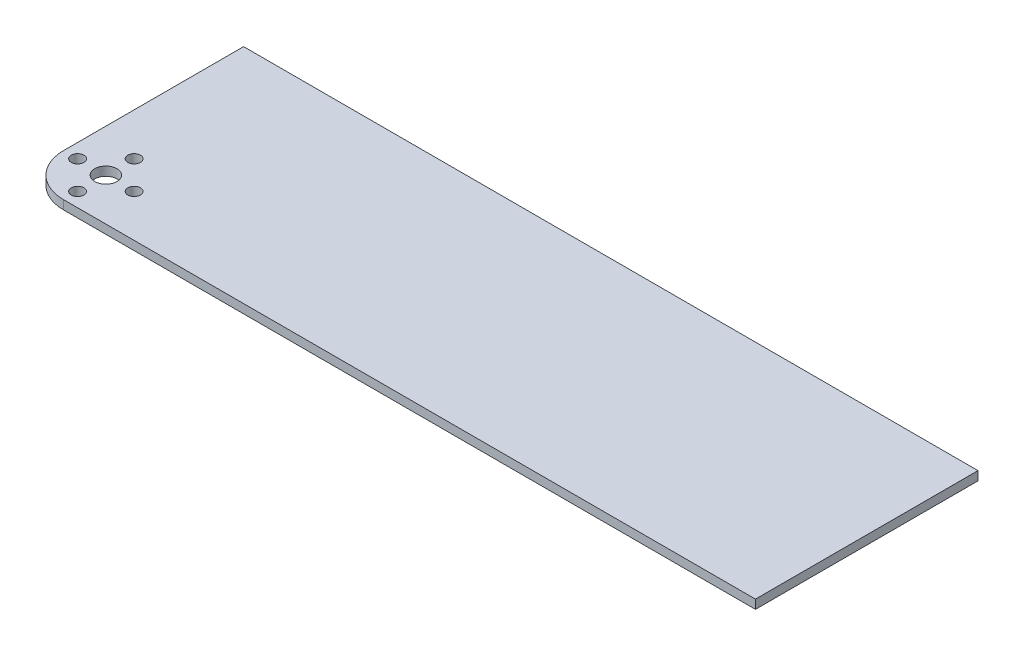
ISO-10303-21;
HEADER;
FILE_DESCRIPTION(('STEP AP214'),'2;1');
FILE_NAME('part.step','',(''),(''),'','','');
FILE_SCHEMA(('AUTOMOTIVE_DESIGN { 1 0 10303 214 1 1 1 1 }'));
ENDSEC;
DATA;
#1=APPLICATION_CONTEXT('core data for automotive mechanical design processes');
#2=APPLICATION_PROTOCOL_DEFINITION('international standard','automotive_design',2000,#1);
#3=PRODUCT_CONTEXT('',#1,'mechanical');
#4=PRODUCT('Part','Part','',(#3));
#5=PRODUCT_RELATED_PRODUCT_CATEGORY('part','',(#4));
#6=PRODUCT_DEFINITION_FORMATION('','',#4);
#7=PRODUCT_DEFINITION_CONTEXT('part definition',#1,'design');
#8=PRODUCT_DEFINITION('design','',#6,#7);
#9=PRODUCT_DEFINITION_SHAPE('','',#8);
#10=(LENGTH_UNIT() NAMED_UNIT(*) SI_UNIT(.MILLI.,.METRE.));
#11=(NAMED_UNIT(*) PLANE_ANGLE_UNIT() SI_UNIT($,.RADIAN.));
#12=(NAMED_UNIT(*) SI_UNIT($,.STERADIAN.) SOLID_ANGLE_UNIT());
#13=UNCERTAINTY_MEASURE_WITH_UNIT(LENGTH_MEASURE(1.E-05),#10,'distance_accuracy_value','');
#14=(GEOMETRIC_REPRESENTATION_CONTEXT(3) GLOBAL_UNCERTAINTY_ASSIGNED_CONTEXT((#13)) GLOBAL_UNIT_ASSIGNED_CONTEXT((#10,
#11,#12)) REPRESENTATION_CONTEXT('',''));
#15=CARTESIAN_POINT('',(0.,0.,0.));
#16=DIRECTION('',(0.,0.,1.));
#17=DIRECTION('',(1.,0.,0.));
#18=AXIS2_PLACEMENT_3D('',#15,#16,#17);
#19=CARTESIAN_POINT('',(-82.5,2.,0.));
#20=DIRECTION('',(-1.,0.,0.));
#21=DIRECTION('',(0.,0.,1.));
#22=AXIS2_PLACEMENT_3D('',#19,#20,#21);
#23=PLANE('',#22);
#24=DIRECTION('',(0.,0.,-1.));
#25=VECTOR('',#24,1.);
#26=CARTESIAN_POINT('',(-82.5,0.,0.));
#27=LINE('',#26,#25);
#28=CARTESIAN_POINT('',(-82.5,0.,15.475));
#29=VERTEX_POINT('',#28);
#30=CARTESIAN_POINT('',(-82.5,0.,-25.));
#31=VERTEX_POINT('',#30);
#32=EDGE_CURVE('E111',#29,#31,#27,.T.);
#33=ORIENTED_EDGE('',*,*,#32,.F.);
#34=DIRECTION('',(0.,-1.,0.));
#35=VECTOR('',#34,1.);
#36=CARTESIAN_POINT('',(-82.5,2.,15.475));
#37=LINE('',#36,#35);
#38=CARTESIAN_POINT('',(-82.5,2.,15.475));
#39=VERTEX_POINT('',#38);
#40=EDGE_CURVE('E11',#39,#29,#37,.T.);
#41=ORIENTED_EDGE('',*,*,#40,.F.);
#42=DIRECTION('',(0.,0.,-1.));
#43=VECTOR('',#42,1.);
#44=CARTESIAN_POINT('',(-82.5,2.,0.));
#45=LINE('',#44,#43);
#46=CARTESIAN_POINT('',(-82.5,2.,-25.));
#47=VERTEX_POINT('',#46);
#48=EDGE_CURVE('E122',#39,#47,#45,.T.);
#49=ORIENTED_EDGE('',*,*,#48,.T.);
#50=DIRECTION('',(0.,-1.,0.));
#51=VECTOR('',#50,1.);
#52=CARTESIAN_POINT('',(-82.5,2.,-25.));
#53=LINE('',#52,#51);
#54=EDGE_CURVE('E53',#47,#31,#53,.T.);
#55=ORIENTED_EDGE('',*,*,#54,.T.);
#56=EDGE_LOOP('',(#33,#41,#49,#55));
#57=FACE_BOUND('',#56,.T.);
#58=ADVANCED_FACE('F35',(#57),#23,.T.);
#59=CARTESIAN_POINT('',(-72.975,2.,15.475));
#60=DIRECTION('',(0.,-1.,0.));
#61=DIRECTION('',(0.,0.,-1.));
#62=AXIS2_PLACEMENT_3D('',#59,#60,#61);
#63=CYLINDRICAL_SURFACE('',#62,9.52500000000001);
#64=CARTESIAN_POINT('',(-72.975,0.,15.475));
#65=DIRECTION('',(0.,1.,0.));
#66=DIRECTION('',(0.,0.,1.));
#67=AXIS2_PLACEMENT_3D('',#64,#65,#66);
#68=CIRCLE('',#67,9.52500000000001);
#69=CARTESIAN_POINT('',(-72.975,0.,25.));
#70=VERTEX_POINT('',#69);
#71=EDGE_CURVE('E113',#29,#70,#68,.T.);
#72=ORIENTED_EDGE('',*,*,#71,.T.);
#73=DIRECTION('',(0.,-1.,0.));
#74=VECTOR('',#73,1.);
#75=CARTESIAN_POINT('',(-72.975,2.,25.));
#76=LINE('',#75,#74);
#77=CARTESIAN_POINT('',(-72.975,2.,25.));
#78=VERTEX_POINT('',#77);
#79=EDGE_CURVE('E44',#78,#70,#76,.T.);
#80=ORIENTED_EDGE('',*,*,#79,.F.);
#81=CARTESIAN_POINT('',(-72.975,2.,15.475));
#82=DIRECTION('',(0.,1.,0.));
#83=DIRECTION('',(0.,0.,1.));
#84=AXIS2_PLACEMENT_3D('',#81,#82,#83);
#85=CIRCLE('',#84,9.52500000000001);
#86=EDGE_CURVE('E92',#39,#78,#85,.T.);
#87=ORIENTED_EDGE('',*,*,#86,.F.);
#88=ORIENTED_EDGE('',*,*,#40,.T.);
#89=EDGE_LOOP('',(#72,#80,#87,#88));
#90=FACE_BOUND('',#89,.T.);
#91=ADVANCED_FACE('F163',(#90),#63,.T.);
#92=CARTESIAN_POINT('',(0.,2.,25.));
#93=DIRECTION('',(0.,0.,-1.));
#94=DIRECTION('',(-1.,0.,0.));
#95=AXIS2_PLACEMENT_3D('',#92,#93,#94);
#96=PLANE('',#95);
#97=DIRECTION('',(1.,0.,0.));
#98=VECTOR('',#97,1.);
#99=CARTESIAN_POINT('',(0.,0.,25.));
#100=LINE('',#99,#98);
#101=CARTESIAN_POINT('',(82.5,0.,25.));
#102=VERTEX_POINT('',#101);
#103=EDGE_CURVE('E101',#70,#102,#100,.T.);
#104=ORIENTED_EDGE('',*,*,#103,.T.);
#105=DIRECTION('',(0.,-1.,0.));
#106=VECTOR('',#105,1.);
#107=CARTESIAN_POINT('',(82.5,2.,25.));
#108=LINE('',#107,#106);
#109=CARTESIAN_POINT('',(82.5,2.,25.));
#110=VERTEX_POINT('',#109);
#111=EDGE_CURVE('E98',#110,#102,#108,.T.);
#112=ORIENTED_EDGE('',*,*,#111,.F.);
#113=DIRECTION('',(1.,0.,0.));
#114=VECTOR('',#113,1.);
#115=CARTESIAN_POINT('',(0.,2.,25.));
#116=LINE('',#115,#114);
#117=EDGE_CURVE('E85',#78,#110,#116,.T.);
#118=ORIENTED_EDGE('',*,*,#117,.F.);
#119=ORIENTED_EDGE('',*,*,#79,.T.);
#120=EDGE_LOOP('',(#104,#112,#118,#119));
#121=FACE_BOUND('',#120,.T.);
#122=ADVANCED_FACE('F99',(#121),#96,.F.);
#123=CARTESIAN_POINT('',(82.5,2.,0.));
#124=DIRECTION('',(-1.,0.,0.));
#125=DIRECTION('',(0.,0.,1.));
#126=AXIS2_PLACEMENT_3D('',#123,#124,#125);
#127=PLANE('',#126);
#128=DIRECTION('',(0.,0.,-1.));
#129=VECTOR('',#128,1.);
#130=CARTESIAN_POINT('',(82.5,0.,0.));
#131=LINE('',#130,#129);
#132=CARTESIAN_POINT('',(82.5,0.,-25.));
#133=VERTEX_POINT('',#132);
#134=EDGE_CURVE('E117',#102,#133,#131,.T.);
#135=ORIENTED_EDGE('',*,*,#134,.T.);
#136=DIRECTION('',(0.,-1.,0.));
#137=VECTOR('',#136,1.);
#138=CARTESIAN_POINT('',(82.5,2.,-25.));
#139=LINE('',#138,#137);
#140=CARTESIAN_POINT('',(82.5,2.,-25.));
#141=VERTEX_POINT('',#140);
#142=EDGE_CURVE('E70',#141,#133,#139,.T.);
#143=ORIENTED_EDGE('',*,*,#142,.F.);
#144=DIRECTION('',(0.,0.,-1.));
#145=VECTOR('',#144,1.);
#146=CARTESIAN_POINT('',(82.5,2.,0.));
#147=LINE('',#146,#145);
#148=EDGE_CURVE('E91',#110,#141,#147,.T.);
#149=ORIENTED_EDGE('',*,*,#148,.F.);
#150=ORIENTED_EDGE('',*,*,#111,.T.);
#151=EDGE_LOOP('',(#135,#143,#149,#150));
#152=FACE_BOUND('',#151,.T.);
#153=ADVANCED_FACE('F105',(#152),#127,.F.);
#154=CARTESIAN_POINT('',(0.,2.,-25.));
#155=DIRECTION('',(0.,0.,-1.));
#156=DIRECTION('',(-1.,0.,0.));
#157=AXIS2_PLACEMENT_3D('',#154,#155,#156);
#158=PLANE('',#157);
#159=DIRECTION('',(1.,0.,0.));
#160=VECTOR('',#159,1.);
#161=CARTESIAN_POINT('',(0.,0.,-25.));
#162=LINE('',#161,#160);
#163=EDGE_CURVE('E119',#31,#133,#162,.T.);
#164=ORIENTED_EDGE('',*,*,#163,.F.);
#165=ORIENTED_EDGE('',*,*,#54,.F.);
#166=DIRECTION('',(1.,0.,0.));
#167=VECTOR('',#166,1.);
#168=CARTESIAN_POINT('',(0.,2.,-25.));
#169=LINE('',#168,#167);
#170=EDGE_CURVE('E106',#47,#141,#169,.T.);
#171=ORIENTED_EDGE('',*,*,#170,.T.);
#172=ORIENTED_EDGE('',*,*,#142,.T.);
#173=EDGE_LOOP('',(#164,#165,#171,#172));
#174=FACE_BOUND('',#173,.T.);
#175=ADVANCED_FACE('F150',(#174),#158,.T.);
#176=CARTESIAN_POINT('',(0.,2.,0.));
#177=DIRECTION('',(0.,1.,0.));
#178=DIRECTION('',(0.,0.,1.));
#179=AXIS2_PLACEMENT_3D('',#176,#177,#178);
#180=PLANE('',#179);
#181=CARTESIAN_POINT('',(-72.975,2.,15.475));
#182=DIRECTION('',(0.,1.,0.));
#183=DIRECTION('',(0.,0.,1.));
#184=AXIS2_PLACEMENT_3D('',#181,#182,#183);
#185=CIRCLE('',#184,2.5);
#186=CARTESIAN_POINT('',(-72.975,2.,17.975));
#187=VERTEX_POINT('',#186);
#188=EDGE_CURVE('E203',#187,#187,#185,.T.);
#189=ORIENTED_EDGE('',*,*,#188,.F.);
#190=EDGE_LOOP('',(#189));
#191=FACE_BOUND('',#190,.T.);
#192=CARTESIAN_POINT('',(-72.9749999999999,2.,21.825));
#193=DIRECTION('',(0.,1.,0.));
#194=DIRECTION('',(0.,0.,1.));
#195=AXIS2_PLACEMENT_3D('',#192,#193,#194);
#196=CIRCLE('',#195,1.42000000000002);
#197=CARTESIAN_POINT('',(-72.9749999999999,2.,23.245));
#198=VERTEX_POINT('',#197);
#199=EDGE_CURVE('E201',#198,#198,#196,.T.);
#200=ORIENTED_EDGE('',*,*,#199,.F.);
#201=EDGE_LOOP('',(#200));
#202=FACE_BOUND('',#201,.T.);
#203=CARTESIAN_POINT('',(-79.3249999999999,2.,15.475));
#204=DIRECTION('',(0.,1.,0.));
#205=DIRECTION('',(0.,0.,1.));
#206=AXIS2_PLACEMENT_3D('',#203,#204,#205);
#207=CIRCLE('',#206,1.42000000000001);
#208=CARTESIAN_POINT('',(-79.3249999999999,2.,16.895));
#209=VERTEX_POINT('',#208);
#210=EDGE_CURVE('E148',#209,#209,#207,.T.);
#211=ORIENTED_EDGE('',*,*,#210,.F.);
#212=EDGE_LOOP('',(#211));
#213=FACE_BOUND('',#212,.T.);
#214=CARTESIAN_POINT('',(-72.975,2.,9.12500000000001));
#215=DIRECTION('',(0.,1.,0.));
#216=DIRECTION('',(0.,0.,1.));
#217=AXIS2_PLACEMENT_3D('',#214,#215,#216);
#218=CIRCLE('',#217,1.42000000000001);
#219=CARTESIAN_POINT('',(-72.975,2.,10.545));
#220=VERTEX_POINT('',#219);
#221=EDGE_CURVE('E133',#220,#220,#218,.T.);
#222=ORIENTED_EDGE('',*,*,#221,.F.);
#223=EDGE_LOOP('',(#222));
#224=FACE_BOUND('',#223,.T.);
#225=CARTESIAN_POINT('',(-66.6249999999999,2.,15.4749999999999));
#226=DIRECTION('',(0.,1.,0.));
#227=DIRECTION('',(0.,0.,1.));
#228=AXIS2_PLACEMENT_3D('',#225,#226,#227);
#229=CIRCLE('',#228,1.42000000000001);
#230=CARTESIAN_POINT('',(-66.6249999999999,2.,16.895));
#231=VERTEX_POINT('',#230);
#232=EDGE_CURVE('E128',#231,#231,#229,.T.);
#233=ORIENTED_EDGE('',*,*,#232,.F.);
#234=EDGE_LOOP('',(#233));
#235=FACE_BOUND('',#234,.T.);
#236=ORIENTED_EDGE('',*,*,#48,.F.);
#237=ORIENTED_EDGE('',*,*,#86,.T.);
#238=ORIENTED_EDGE('',*,*,#117,.T.);
#239=ORIENTED_EDGE('',*,*,#148,.T.);
#240=ORIENTED_EDGE('',*,*,#170,.F.);
#241=EDGE_LOOP('',(#236,#237,#238,#239,#240));
#242=FACE_BOUND('',#241,.T.);
#243=ADVANCED_FACE('F88',(#191,#202,#213,#224,#235,#242),#180,.T.);
#244=CARTESIAN_POINT('',(0.,0.,0.));
#245=DIRECTION('',(0.,1.,0.));
#246=DIRECTION('',(0.,0.,1.));
#247=AXIS2_PLACEMENT_3D('',#244,#245,#246);
#248=PLANE('',#247);
#249=CARTESIAN_POINT('',(-72.975,0.,15.475));
#250=DIRECTION('',(0.,1.,0.));
#251=DIRECTION('',(0.,0.,1.));
#252=AXIS2_PLACEMENT_3D('',#249,#250,#251);
#253=CIRCLE('',#252,2.5);
#254=CARTESIAN_POINT('',(-72.975,0.,17.975));
#255=VERTEX_POINT('',#254);
#256=EDGE_CURVE('E38',#255,#255,#253,.T.);
#257=ORIENTED_EDGE('',*,*,#256,.T.);
#258=EDGE_LOOP('',(#257));
#259=FACE_BOUND('',#258,.T.);
#260=CARTESIAN_POINT('',(-72.9749999999999,0.,21.825));
#261=DIRECTION('',(0.,1.,0.));
#262=DIRECTION('',(0.,0.,1.));
#263=AXIS2_PLACEMENT_3D('',#260,#261,#262);
#264=CIRCLE('',#263,1.42000000000002);
#265=CARTESIAN_POINT('',(-72.9749999999999,0.,23.245));
#266=VERTEX_POINT('',#265);
#267=EDGE_CURVE('E135',#266,#266,#264,.T.);
#268=ORIENTED_EDGE('',*,*,#267,.T.);
#269=EDGE_LOOP('',(#268));
#270=FACE_BOUND('',#269,.T.);
#271=CARTESIAN_POINT('',(-79.3249999999999,0.,15.475));
#272=DIRECTION('',(0.,1.,0.));
#273=DIRECTION('',(0.,0.,1.));
#274=AXIS2_PLACEMENT_3D('',#271,#272,#273);
#275=CIRCLE('',#274,1.42000000000001);
#276=CARTESIAN_POINT('',(-79.3249999999999,0.,16.895));
#277=VERTEX_POINT('',#276);
#278=EDGE_CURVE('E132',#277,#277,#275,.T.);
#279=ORIENTED_EDGE('',*,*,#278,.T.);
#280=EDGE_LOOP('',(#279));
#281=FACE_BOUND('',#280,.T.);
#282=CARTESIAN_POINT('',(-72.975,0.,9.12500000000001));
#283=DIRECTION('',(0.,1.,0.));
#284=DIRECTION('',(0.,0.,1.));
#285=AXIS2_PLACEMENT_3D('',#282,#283,#284);
#286=CIRCLE('',#285,1.42000000000001);
#287=CARTESIAN_POINT('',(-72.975,0.,10.545));
#288=VERTEX_POINT('',#287);
#289=EDGE_CURVE('E129',#288,#288,#286,.T.);
#290=ORIENTED_EDGE('',*,*,#289,.T.);
#291=EDGE_LOOP('',(#290));
#292=FACE_BOUND('',#291,.T.);
#293=CARTESIAN_POINT('',(-66.6249999999999,0.,15.4749999999999));
#294=DIRECTION('',(0.,1.,0.));
#295=DIRECTION('',(0.,0.,1.));
#296=AXIS2_PLACEMENT_3D('',#293,#294,#295);
#297=CIRCLE('',#296,1.42000000000001);
#298=CARTESIAN_POINT('',(-66.6249999999999,0.,16.895));
#299=VERTEX_POINT('',#298);
#300=EDGE_CURVE('E114',#299,#299,#297,.T.);
#301=ORIENTED_EDGE('',*,*,#300,.T.);
#302=EDGE_LOOP('',(#301));
#303=FACE_BOUND('',#302,.T.);
#304=ORIENTED_EDGE('',*,*,#32,.T.);
#305=ORIENTED_EDGE('',*,*,#163,.T.);
#306=ORIENTED_EDGE('',*,*,#134,.F.);
#307=ORIENTED_EDGE('',*,*,#103,.F.);
#308=ORIENTED_EDGE('',*,*,#71,.F.);
#309=EDGE_LOOP('',(#304,#305,#306,#307,#308));
#310=FACE_BOUND('',#309,.T.);
#311=ADVANCED_FACE('F157',(#259,#270,#281,#292,#303,#310),#248,.F.);
#312=CARTESIAN_POINT('',(-66.6249999999999,-4.35,15.4749999999999));
#313=DIRECTION('',(0.,1.,0.));
#314=DIRECTION('',(0.,0.,1.));
#315=AXIS2_PLACEMENT_3D('',#312,#313,#314);
#316=CYLINDRICAL_SURFACE('',#315,1.42000000000001);
#317=ORIENTED_EDGE('',*,*,#232,.T.);
#318=EDGE_LOOP('',(#317));
#319=FACE_BOUND('',#318,.T.);
#320=ORIENTED_EDGE('',*,*,#300,.F.);
#321=EDGE_LOOP('',(#320));
#322=FACE_BOUND('',#321,.T.);
#323=ADVANCED_FACE('F175',(#319,#322),#316,.F.);
#324=CARTESIAN_POINT('',(-72.975,-4.35,9.12500000000001));
#325=DIRECTION('',(0.,1.,0.));
#326=DIRECTION('',(0.,0.,1.));
#327=AXIS2_PLACEMENT_3D('',#324,#325,#326);
#328=CYLINDRICAL_SURFACE('',#327,1.42000000000001);
#329=ORIENTED_EDGE('',*,*,#221,.T.);
#330=EDGE_LOOP('',(#329));
#331=FACE_BOUND('',#330,.T.);
#332=ORIENTED_EDGE('',*,*,#289,.F.);
#333=EDGE_LOOP('',(#332));
#334=FACE_BOUND('',#333,.T.);
#335=ADVANCED_FACE('F179',(#331,#334),#328,.F.);
#336=CARTESIAN_POINT('',(-79.3249999999999,-4.35,15.475));
#337=DIRECTION('',(0.,1.,0.));
#338=DIRECTION('',(0.,0.,1.));
#339=AXIS2_PLACEMENT_3D('',#336,#337,#338);
#340=CYLINDRICAL_SURFACE('',#339,1.42000000000001);
#341=ORIENTED_EDGE('',*,*,#210,.T.);
#342=EDGE_LOOP('',(#341));
#343=FACE_BOUND('',#342,.T.);
#344=ORIENTED_EDGE('',*,*,#278,.F.);
#345=EDGE_LOOP('',(#344));
#346=FACE_BOUND('',#345,.T.);
#347=ADVANCED_FACE('F182',(#343,#346),#340,.F.);
#348=CARTESIAN_POINT('',(-72.9749999999999,-4.35,21.825));
#349=DIRECTION('',(0.,1.,0.));
#350=DIRECTION('',(0.,0.,1.));
#351=AXIS2_PLACEMENT_3D('',#348,#349,#350);
#352=CYLINDRICAL_SURFACE('',#351,1.42000000000002);
#353=ORIENTED_EDGE('',*,*,#199,.T.);
#354=EDGE_LOOP('',(#353));
#355=FACE_BOUND('',#354,.T.);
#356=ORIENTED_EDGE('',*,*,#267,.F.);
#357=EDGE_LOOP('',(#356));
#358=FACE_BOUND('',#357,.T.);
#359=ADVANCED_FACE('F185',(#355,#358),#352,.F.);
#360=CARTESIAN_POINT('',(-72.975,-4.35,15.475));
#361=DIRECTION('',(0.,1.,0.));
#362=DIRECTION('',(0.,0.,1.));
#363=AXIS2_PLACEMENT_3D('',#360,#361,#362);
#364=CYLINDRICAL_SURFACE('',#363,2.5);
#365=ORIENTED_EDGE('',*,*,#188,.T.);
#366=EDGE_LOOP('',(#365));
#367=FACE_BOUND('',#366,.T.);
#368=ORIENTED_EDGE('',*,*,#256,.F.);
#369=EDGE_LOOP('',(#368));
#370=FACE_BOUND('',#369,.T.);
#371=ADVANCED_FACE('F190',(#367,#370),#364,.F.);
#372=CLOSED_SHELL('',(#58,#91,#122,#153,#175,#243,#311,#323,#335,#347,#359,#371));
#373=MANIFOLD_SOLID_BREP('B2',#372);
#374=ADVANCED_BREP_SHAPE_REPRESENTATION('',(#18,#373),#14);
#375=SHAPE_DEFINITION_REPRESENTATION(#9,#374);
ENDSEC;
END-ISO-10303-21;
